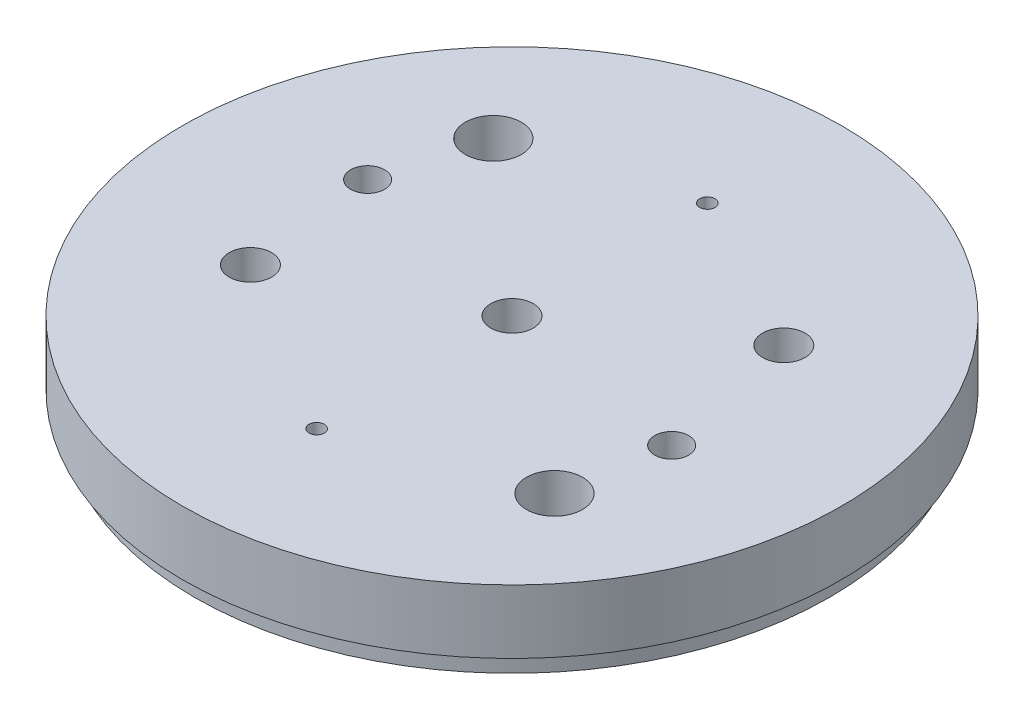
ISO-10303-21;
HEADER;
FILE_DESCRIPTION(('STEP AP214'),'2;1');
FILE_NAME('part.step','',(''),(''),'','','');
FILE_SCHEMA(('AUTOMOTIVE_DESIGN { 1 0 10303 214 1 1 1 1 }'));
ENDSEC;
DATA;
#1=APPLICATION_CONTEXT('core data for automotive mechanical design processes');
#2=APPLICATION_PROTOCOL_DEFINITION('international standard','automotive_design',2000,#1);
#3=PRODUCT_CONTEXT('',#1,'mechanical');
#4=PRODUCT('Part','Part','',(#3));
#5=PRODUCT_RELATED_PRODUCT_CATEGORY('part','',(#4));
#6=PRODUCT_DEFINITION_FORMATION('','',#4);
#7=PRODUCT_DEFINITION_CONTEXT('part definition',#1,'design');
#8=PRODUCT_DEFINITION('design','',#6,#7);
#9=PRODUCT_DEFINITION_SHAPE('','',#8);
#10=(LENGTH_UNIT() NAMED_UNIT(*) SI_UNIT(.MILLI.,.METRE.));
#11=(NAMED_UNIT(*) PLANE_ANGLE_UNIT() SI_UNIT($,.RADIAN.));
#12=(NAMED_UNIT(*) SI_UNIT($,.STERADIAN.) SOLID_ANGLE_UNIT());
#13=UNCERTAINTY_MEASURE_WITH_UNIT(LENGTH_MEASURE(1.E-05),#10,'distance_accuracy_value','');
#14=(GEOMETRIC_REPRESENTATION_CONTEXT(3) GLOBAL_UNCERTAINTY_ASSIGNED_CONTEXT((#13)) GLOBAL_UNIT_ASSIGNED_CONTEXT((#10,
#11,#12)) REPRESENTATION_CONTEXT('',''));
#15=CARTESIAN_POINT('',(0.,0.,0.));
#16=DIRECTION('',(0.,0.,1.));
#17=DIRECTION('',(1.,0.,0.));
#18=AXIS2_PLACEMENT_3D('',#15,#16,#17);
#19=CARTESIAN_POINT('',(0.,-9.525,0.));
#20=DIRECTION('',(0.,1.,0.));
#21=DIRECTION('',(0.,0.,1.));
#22=AXIS2_PLACEMENT_3D('',#19,#20,#21);
#23=CYLINDRICAL_SURFACE('',#22,49.276);
#24=CARTESIAN_POINT('',(0.,-9.525,0.));
#25=DIRECTION('',(0.,1.,0.));
#26=DIRECTION('',(0.,0.,1.));
#27=AXIS2_PLACEMENT_3D('',#24,#25,#26);
#28=CIRCLE('',#27,49.276);
#29=CARTESIAN_POINT('',(0.,-9.525,49.276));
#30=VERTEX_POINT('',#29);
#31=EDGE_CURVE('E39',#30,#30,#28,.T.);
#32=CARTESIAN_POINT('',(0.,0.,0.));
#33=DIRECTION('',(0.,1.,0.));
#34=DIRECTION('',(0.,0.,1.));
#35=AXIS2_PLACEMENT_3D('',#32,#33,#34);
#36=CIRCLE('',#35,49.276);
#37=CARTESIAN_POINT('',(0.,0.,49.276));
#38=VERTEX_POINT('',#37);
#39=EDGE_CURVE('E35',#38,#38,#36,.T.);
#40=CARTESIAN_POINT('',(0.,-9.525,49.276));
#41=CARTESIAN_POINT('',(0.,-9.42578125,49.276));
#42=CARTESIAN_POINT('',(0.,-9.3265625,49.276));
#43=CARTESIAN_POINT('',(0.,-9.128125,49.276));
#44=CARTESIAN_POINT('',(0.,-9.02890625,49.276));
#45=CARTESIAN_POINT('',(0.,-8.83046875,49.276));
#46=CARTESIAN_POINT('',(0.,-8.73125,49.276));
#47=CARTESIAN_POINT('',(0.,-8.5328125,49.276));
#48=CARTESIAN_POINT('',(0.,-8.43359375,49.276));
#49=CARTESIAN_POINT('',(0.,-8.23515625,49.276));
#50=CARTESIAN_POINT('',(0.,-8.1359375,49.276));
#51=CARTESIAN_POINT('',(0.,-7.9375,49.276));
#52=CARTESIAN_POINT('',(0.,-7.83828125,49.276));
#53=CARTESIAN_POINT('',(0.,-7.63984375,49.276));
#54=CARTESIAN_POINT('',(0.,-7.540625,49.276));
#55=CARTESIAN_POINT('',(0.,-7.3421875,49.276));
#56=CARTESIAN_POINT('',(0.,-7.24296875,49.276));
#57=CARTESIAN_POINT('',(0.,-7.04453125,49.276));
#58=CARTESIAN_POINT('',(0.,-6.9453125,49.276));
#59=CARTESIAN_POINT('',(0.,-6.746875,49.276));
#60=CARTESIAN_POINT('',(0.,-6.64765625,49.276));
#61=CARTESIAN_POINT('',(0.,-6.44921875,49.276));
#62=CARTESIAN_POINT('',(0.,-6.35,49.276));
#63=CARTESIAN_POINT('',(0.,-6.1515625,49.276));
#64=CARTESIAN_POINT('',(0.,-6.05234375,49.276));
#65=CARTESIAN_POINT('',(0.,-5.85390625,49.276));
#66=CARTESIAN_POINT('',(0.,-5.7546875,49.276));
#67=CARTESIAN_POINT('',(0.,-5.55625,49.276));
#68=CARTESIAN_POINT('',(0.,-5.45703125,49.276));
#69=CARTESIAN_POINT('',(0.,-5.25859375,49.276));
#70=CARTESIAN_POINT('',(0.,-5.159375,49.276));
#71=CARTESIAN_POINT('',(0.,-4.9609375,49.276));
#72=CARTESIAN_POINT('',(0.,-4.86171875,49.276));
#73=CARTESIAN_POINT('',(0.,-4.66328125,49.276));
#74=CARTESIAN_POINT('',(0.,-4.5640625,49.276));
#75=CARTESIAN_POINT('',(0.,-4.365625,49.276));
#76=CARTESIAN_POINT('',(0.,-4.26640625,49.276));
#77=CARTESIAN_POINT('',(0.,-4.06796875,49.276));
#78=CARTESIAN_POINT('',(0.,-3.96875,49.276));
#79=CARTESIAN_POINT('',(0.,-3.7703125,49.276));
#80=CARTESIAN_POINT('',(0.,-3.67109375,49.276));
#81=CARTESIAN_POINT('',(0.,-3.47265625,49.276));
#82=CARTESIAN_POINT('',(0.,-3.3734375,49.276));
#83=CARTESIAN_POINT('',(0.,-3.175,49.276));
#84=CARTESIAN_POINT('',(0.,-3.07578125,49.276));
#85=CARTESIAN_POINT('',(0.,-2.87734375,49.276));
#86=CARTESIAN_POINT('',(0.,-2.778125,49.276));
#87=CARTESIAN_POINT('',(0.,-2.5796875,49.276));
#88=CARTESIAN_POINT('',(0.,-2.48046875,49.276));
#89=CARTESIAN_POINT('',(0.,-2.28203125,49.276));
#90=CARTESIAN_POINT('',(0.,-2.1828125,49.276));
#91=CARTESIAN_POINT('',(0.,-1.984375,49.276));
#92=CARTESIAN_POINT('',(0.,-1.88515625,49.276));
#93=CARTESIAN_POINT('',(0.,-1.68671875,49.276));
#94=CARTESIAN_POINT('',(0.,-1.5875,49.276));
#95=CARTESIAN_POINT('',(0.,-1.3890625,49.276));
#96=CARTESIAN_POINT('',(0.,-1.28984375,49.276));
#97=CARTESIAN_POINT('',(0.,-1.09140625,49.276));
#98=CARTESIAN_POINT('',(0.,-0.992187500000001,49.276));
#99=CARTESIAN_POINT('',(0.,-0.793750000000001,49.276));
#100=CARTESIAN_POINT('',(0.,-0.69453125,49.276));
#101=CARTESIAN_POINT('',(0.,-0.49609375,49.276));
#102=CARTESIAN_POINT('',(0.,-0.396875,49.276));
#103=CARTESIAN_POINT('',(0.,-0.1984375,49.276));
#104=CARTESIAN_POINT('',(0.,-0.0992187500000001,49.276));
#105=CARTESIAN_POINT('',(0.,0.,49.276));
#106=B_SPLINE_CURVE_WITH_KNOTS('',3,(#40,#41,#42,#43,#44,#45,#46,#47,#48,#49,#50,#51,#52,#53,
#54,#55,#56,#57,#58,#59,#60,#61,#62,#63,#64,#65,#66,#67,#68,#69,#70,#71,#72,#73,#74,#75,#76,#77,
#78,#79,#80,#81,#82,#83,#84,#85,#86,#87,#88,#89,#90,#91,#92,#93,#94,#95,#96,#97,#98,#99,#100,
#101,#102,#103,#104,#105),.UNSPECIFIED.,.F.,.F.,(4,2,2,2,2,2,2,2,2,2,2,2,2,2,2,2,2,2,2,2,2,2,2,
2,2,2,2,2,2,2,2,2,4),(0.,0.29765625,0.5953125,0.892968750000001,1.190625,1.48828125,1.7859375,
2.08359375,2.38125,2.67890625,2.9765625,3.27421875,3.571875,3.86953125,4.1671875,4.46484375,
4.7625,5.06015625,5.3578125,5.65546875,5.953125,6.25078125,6.5484375,6.84609375,7.14375,
7.44140625,7.7390625,8.03671875,8.334375,8.63203125,8.9296875,9.22734375,9.525),.UNSPECIFIED.);
#107=EDGE_CURVE('BSEAM32',#30,#38,#106,.T.);
#108=ORIENTED_EDGE('',*,*,#31,.T.);
#109=ORIENTED_EDGE('',*,*,#39,.F.);
#110=ORIENTED_EDGE('',*,*,#107,.T.);
#111=ORIENTED_EDGE('',*,*,#107,.F.);
#112=EDGE_LOOP('',(#108,#110,#109,#111));
#113=FACE_BOUND('',#112,.T.);
#114=ADVANCED_FACE('F32',(#113),#23,.T.);
#115=CARTESIAN_POINT('',(0.,-9.525,0.));
#116=DIRECTION('',(0.,1.,0.));
#117=DIRECTION('',(0.,0.,1.));
#118=AXIS2_PLACEMENT_3D('',#115,#116,#117);
#119=PLANE('',#118);
#120=CARTESIAN_POINT('',(0.,-9.525,0.));
#121=DIRECTION('',(0.,-1.,0.));
#122=DIRECTION('',(0.,0.,-1.));
#123=AXIS2_PLACEMENT_3D('',#120,#121,#122);
#124=CIRCLE('',#123,47.498);
#125=CARTESIAN_POINT('',(0.,-9.525,-47.498));
#126=VERTEX_POINT('',#125);
#127=EDGE_CURVE('E10',#126,#126,#124,.T.);
#128=ORIENTED_EDGE('',*,*,#127,.F.);
#129=EDGE_LOOP('',(#128));
#130=FACE_BOUND('',#129,.T.);
#131=ORIENTED_EDGE('',*,*,#31,.F.);
#132=EDGE_LOOP('',(#131));
#133=FACE_BOUND('',#132,.T.);
#134=ADVANCED_FACE('F118',(#130,#133),#119,.F.);
#135=CARTESIAN_POINT('',(0.,0.,0.));
#136=DIRECTION('',(0.,1.,0.));
#137=DIRECTION('',(0.,0.,1.));
#138=AXIS2_PLACEMENT_3D('',#135,#136,#137);
#139=PLANE('',#138);
#140=CARTESIAN_POINT('',(0.,0.,-29.21));
#141=DIRECTION('',(0.,1.,0.));
#142=DIRECTION('',(0.,0.,1.));
#143=AXIS2_PLACEMENT_3D('',#140,#141,#142);
#144=CIRCLE('',#143,1.143);
#145=CARTESIAN_POINT('',(0.,0.,-28.067));
#146=VERTEX_POINT('',#145);
#147=EDGE_CURVE('E74',#146,#146,#144,.T.);
#148=ORIENTED_EDGE('',*,*,#147,.F.);
#149=EDGE_LOOP('',(#148));
#150=FACE_BOUND('',#149,.T.);
#151=CARTESIAN_POINT('',(0.,0.,29.21));
#152=DIRECTION('',(0.,1.,0.));
#153=DIRECTION('',(0.,0.,1.));
#154=AXIS2_PLACEMENT_3D('',#151,#152,#153);
#155=CIRCLE('',#154,1.143);
#156=CARTESIAN_POINT('',(0.,0.,30.353));
#157=VERTEX_POINT('',#156);
#158=EDGE_CURVE('E68',#157,#157,#155,.T.);
#159=ORIENTED_EDGE('',*,*,#158,.F.);
#160=EDGE_LOOP('',(#159));
#161=FACE_BOUND('',#160,.T.);
#162=CARTESIAN_POINT('',(-24.384,0.,-21.59));
#163=DIRECTION('',(0.,1.,0.));
#164=DIRECTION('',(0.,0.,1.));
#165=AXIS2_PLACEMENT_3D('',#162,#163,#164);
#166=CIRCLE('',#165,4.191);
#167=CARTESIAN_POINT('',(-24.384,0.,-17.399));
#168=VERTEX_POINT('',#167);
#169=EDGE_CURVE('E62',#168,#168,#166,.T.);
#170=ORIENTED_EDGE('',*,*,#169,.F.);
#171=EDGE_LOOP('',(#170));
#172=FACE_BOUND('',#171,.T.);
#173=CARTESIAN_POINT('',(-28.448,0.,-6.858));
#174=DIRECTION('',(0.,1.,0.));
#175=DIRECTION('',(0.,0.,1.));
#176=AXIS2_PLACEMENT_3D('',#173,#174,#175);
#177=CIRCLE('',#176,2.54);
#178=CARTESIAN_POINT('',(-28.448,0.,-4.318));
#179=VERTEX_POINT('',#178);
#180=EDGE_CURVE('E55',#179,#179,#177,.T.);
#181=ORIENTED_EDGE('',*,*,#180,.F.);
#182=EDGE_LOOP('',(#181));
#183=FACE_BOUND('',#182,.T.);
#184=CARTESIAN_POINT('',(-26.162,0.,12.954));
#185=DIRECTION('',(0.,1.,0.));
#186=DIRECTION('',(0.,0.,1.));
#187=AXIS2_PLACEMENT_3D('',#184,#185,#186);
#188=CIRCLE('',#187,3.175);
#189=CARTESIAN_POINT('',(-26.162,0.,16.129));
#190=VERTEX_POINT('',#189);
#191=EDGE_CURVE('E97',#190,#190,#188,.T.);
#192=ORIENTED_EDGE('',*,*,#191,.F.);
#193=EDGE_LOOP('',(#192));
#194=FACE_BOUND('',#193,.T.);
#195=CARTESIAN_POINT('',(26.162,0.,19.812));
#196=DIRECTION('',(0.,1.,0.));
#197=DIRECTION('',(0.,0.,1.));
#198=AXIS2_PLACEMENT_3D('',#195,#196,#197);
#199=CIRCLE('',#198,4.191);
#200=CARTESIAN_POINT('',(26.162,0.,24.003));
#201=VERTEX_POINT('',#200);
#202=EDGE_CURVE('E91',#201,#201,#199,.T.);
#203=ORIENTED_EDGE('',*,*,#202,.F.);
#204=EDGE_LOOP('',(#203));
#205=FACE_BOUND('',#204,.T.);
#206=CARTESIAN_POINT('',(28.702,0.,4.826));
#207=DIRECTION('',(0.,1.,0.));
#208=DIRECTION('',(0.,0.,1.));
#209=AXIS2_PLACEMENT_3D('',#206,#207,#208);
#210=CIRCLE('',#209,2.54);
#211=CARTESIAN_POINT('',(28.702,0.,7.366));
#212=VERTEX_POINT('',#211);
#213=EDGE_CURVE('E85',#212,#212,#210,.T.);
#214=ORIENTED_EDGE('',*,*,#213,.F.);
#215=EDGE_LOOP('',(#214));
#216=FACE_BOUND('',#215,.T.);
#217=CARTESIAN_POINT('',(24.13,0.,-16.51));
#218=DIRECTION('',(0.,1.,0.));
#219=DIRECTION('',(0.,0.,1.));
#220=AXIS2_PLACEMENT_3D('',#217,#218,#219);
#221=CIRCLE('',#220,3.175);
#222=CARTESIAN_POINT('',(24.13,0.,-13.335));
#223=VERTEX_POINT('',#222);
#224=EDGE_CURVE('E79',#223,#223,#221,.T.);
#225=ORIENTED_EDGE('',*,*,#224,.F.);
#226=EDGE_LOOP('',(#225));
#227=FACE_BOUND('',#226,.T.);
#228=CARTESIAN_POINT('',(0.,0.,0.));
#229=DIRECTION('',(0.,1.,0.));
#230=DIRECTION('',(0.,0.,1.));
#231=AXIS2_PLACEMENT_3D('',#228,#229,#230);
#232=CIRCLE('',#231,3.175);
#233=CARTESIAN_POINT('',(0.,0.,3.175));
#234=VERTEX_POINT('',#233);
#235=EDGE_CURVE('E49',#234,#234,#232,.T.);
#236=ORIENTED_EDGE('',*,*,#235,.F.);
#237=EDGE_LOOP('',(#236));
#238=FACE_BOUND('',#237,.T.);
#239=ORIENTED_EDGE('',*,*,#39,.T.);
#240=EDGE_LOOP('',(#239));
#241=FACE_BOUND('',#240,.T.);
#242=ADVANCED_FACE('F114',(#150,#161,#172,#183,#194,#205,#216,#227,#238,#241),#139,.T.);
#243=CARTESIAN_POINT('',(0.,-12.7,0.));
#244=DIRECTION('',(0.,1.,0.));
#245=DIRECTION('',(0.,0.,1.));
#246=AXIS2_PLACEMENT_3D('',#243,#244,#245);
#247=CYLINDRICAL_SURFACE('',#246,47.498);
#248=CARTESIAN_POINT('',(0.,-12.7,0.));
#249=DIRECTION('',(0.,-1.,0.));
#250=DIRECTION('',(0.,0.,-1.));
#251=AXIS2_PLACEMENT_3D('',#248,#249,#250);
#252=CIRCLE('',#251,47.498);
#253=CARTESIAN_POINT('',(0.,-12.7,-47.498));
#254=VERTEX_POINT('',#253);
#255=EDGE_CURVE('E45',#254,#254,#252,.T.);
#256=ORIENTED_EDGE('',*,*,#255,.F.);
#257=EDGE_LOOP('',(#256));
#258=FACE_BOUND('',#257,.T.);
#259=ORIENTED_EDGE('',*,*,#127,.T.);
#260=EDGE_LOOP('',(#259));
#261=FACE_BOUND('',#260,.T.);
#262=ADVANCED_FACE('F117',(#258,#261),#247,.T.);
#263=CARTESIAN_POINT('',(0.,-12.7,0.));
#264=DIRECTION('',(0.,-1.,0.));
#265=DIRECTION('',(0.,0.,-1.));
#266=AXIS2_PLACEMENT_3D('',#263,#264,#265);
#267=PLANE('',#266);
#268=CARTESIAN_POINT('',(0.,-12.7,-29.21));
#269=DIRECTION('',(0.,1.,0.));
#270=DIRECTION('',(0.,0.,1.));
#271=AXIS2_PLACEMENT_3D('',#268,#269,#270);
#272=CIRCLE('',#271,1.143);
#273=CARTESIAN_POINT('',(0.,-12.7,-28.067));
#274=VERTEX_POINT('',#273);
#275=EDGE_CURVE('E52',#274,#274,#272,.T.);
#276=ORIENTED_EDGE('',*,*,#275,.T.);
#277=EDGE_LOOP('',(#276));
#278=FACE_BOUND('',#277,.T.);
#279=CARTESIAN_POINT('',(0.,-12.7,29.21));
#280=DIRECTION('',(0.,1.,0.));
#281=DIRECTION('',(0.,0.,1.));
#282=AXIS2_PLACEMENT_3D('',#279,#280,#281);
#283=CIRCLE('',#282,1.143);
#284=CARTESIAN_POINT('',(0.,-12.7,30.353));
#285=VERTEX_POINT('',#284);
#286=EDGE_CURVE('E71',#285,#285,#283,.T.);
#287=ORIENTED_EDGE('',*,*,#286,.T.);
#288=EDGE_LOOP('',(#287));
#289=FACE_BOUND('',#288,.T.);
#290=CARTESIAN_POINT('',(-24.384,-12.7,-21.59));
#291=DIRECTION('',(0.,1.,0.));
#292=DIRECTION('',(0.,0.,1.));
#293=AXIS2_PLACEMENT_3D('',#290,#291,#292);
#294=CIRCLE('',#293,4.191);
#295=CARTESIAN_POINT('',(-24.384,-12.7,-17.399));
#296=VERTEX_POINT('',#295);
#297=EDGE_CURVE('E65',#296,#296,#294,.T.);
#298=ORIENTED_EDGE('',*,*,#297,.T.);
#299=EDGE_LOOP('',(#298));
#300=FACE_BOUND('',#299,.T.);
#301=CARTESIAN_POINT('',(-28.448,-12.7,-6.858));
#302=DIRECTION('',(0.,1.,0.));
#303=DIRECTION('',(0.,0.,1.));
#304=AXIS2_PLACEMENT_3D('',#301,#302,#303);
#305=CIRCLE('',#304,2.54);
#306=CARTESIAN_POINT('',(-28.448,-12.7,-4.318));
#307=VERTEX_POINT('',#306);
#308=EDGE_CURVE('E58',#307,#307,#305,.T.);
#309=ORIENTED_EDGE('',*,*,#308,.T.);
#310=EDGE_LOOP('',(#309));
#311=FACE_BOUND('',#310,.T.);
#312=CARTESIAN_POINT('',(-26.162,-12.7,12.954));
#313=DIRECTION('',(0.,1.,0.));
#314=DIRECTION('',(0.,0.,1.));
#315=AXIS2_PLACEMENT_3D('',#312,#313,#314);
#316=CIRCLE('',#315,3.175);
#317=CARTESIAN_POINT('',(-26.162,-12.7,16.129));
#318=VERTEX_POINT('',#317);
#319=EDGE_CURVE('E59',#318,#318,#316,.T.);
#320=ORIENTED_EDGE('',*,*,#319,.T.);
#321=EDGE_LOOP('',(#320));
#322=FACE_BOUND('',#321,.T.);
#323=CARTESIAN_POINT('',(26.162,-12.7,19.812));
#324=DIRECTION('',(0.,1.,0.));
#325=DIRECTION('',(0.,0.,1.));
#326=AXIS2_PLACEMENT_3D('',#323,#324,#325);
#327=CIRCLE('',#326,4.191);
#328=CARTESIAN_POINT('',(26.162,-12.7,24.003));
#329=VERTEX_POINT('',#328);
#330=EDGE_CURVE('E94',#329,#329,#327,.T.);
#331=ORIENTED_EDGE('',*,*,#330,.T.);
#332=EDGE_LOOP('',(#331));
#333=FACE_BOUND('',#332,.T.);
#334=CARTESIAN_POINT('',(28.702,-12.7,4.826));
#335=DIRECTION('',(0.,1.,0.));
#336=DIRECTION('',(0.,0.,1.));
#337=AXIS2_PLACEMENT_3D('',#334,#335,#336);
#338=CIRCLE('',#337,2.54);
#339=CARTESIAN_POINT('',(28.702,-12.7,7.366));
#340=VERTEX_POINT('',#339);
#341=EDGE_CURVE('E88',#340,#340,#338,.T.);
#342=ORIENTED_EDGE('',*,*,#341,.T.);
#343=EDGE_LOOP('',(#342));
#344=FACE_BOUND('',#343,.T.);
#345=CARTESIAN_POINT('',(24.13,-12.7,-16.51));
#346=DIRECTION('',(0.,1.,0.));
#347=DIRECTION('',(0.,0.,1.));
#348=AXIS2_PLACEMENT_3D('',#345,#346,#347);
#349=CIRCLE('',#348,3.175);
#350=CARTESIAN_POINT('',(24.13,-12.7,-13.335));
#351=VERTEX_POINT('',#350);
#352=EDGE_CURVE('E82',#351,#351,#349,.T.);
#353=ORIENTED_EDGE('',*,*,#352,.T.);
#354=EDGE_LOOP('',(#353));
#355=FACE_BOUND('',#354,.T.);
#356=CARTESIAN_POINT('',(0.,-12.7,0.));
#357=DIRECTION('',(0.,1.,0.));
#358=DIRECTION('',(0.,0.,1.));
#359=AXIS2_PLACEMENT_3D('',#356,#357,#358);
#360=CIRCLE('',#359,3.175);
#361=CARTESIAN_POINT('',(0.,-12.7,3.175));
#362=VERTEX_POINT('',#361);
#363=EDGE_CURVE('E48',#362,#362,#360,.T.);
#364=ORIENTED_EDGE('',*,*,#363,.T.);
#365=EDGE_LOOP('',(#364));
#366=FACE_BOUND('',#365,.T.);
#367=ORIENTED_EDGE('',*,*,#255,.T.);
#368=EDGE_LOOP('',(#367));
#369=FACE_BOUND('',#368,.T.);
#370=ADVANCED_FACE('F103',(#278,#289,#300,#311,#322,#333,#344,#355,#366,#369),#267,.T.);
#371=CARTESIAN_POINT('',(0.,-12.7,0.));
#372=DIRECTION('',(0.,1.,0.));
#373=DIRECTION('',(0.,0.,1.));
#374=AXIS2_PLACEMENT_3D('',#371,#372,#373);
#375=CYLINDRICAL_SURFACE('',#374,3.175);
#376=ORIENTED_EDGE('',*,*,#363,.F.);
#377=EDGE_LOOP('',(#376));
#378=FACE_BOUND('',#377,.T.);
#379=ORIENTED_EDGE('',*,*,#235,.T.);
#380=EDGE_LOOP('',(#379));
#381=FACE_BOUND('',#380,.T.);
#382=ADVANCED_FACE('F148',(#378,#381),#375,.F.);
#383=CARTESIAN_POINT('',(24.13,-12.7,-16.51));
#384=DIRECTION('',(0.,1.,0.));
#385=DIRECTION('',(0.,0.,1.));
#386=AXIS2_PLACEMENT_3D('',#383,#384,#385);
#387=CYLINDRICAL_SURFACE('',#386,3.175);
#388=ORIENTED_EDGE('',*,*,#352,.F.);
#389=EDGE_LOOP('',(#388));
#390=FACE_BOUND('',#389,.T.);
#391=ORIENTED_EDGE('',*,*,#224,.T.);
#392=EDGE_LOOP('',(#391));
#393=FACE_BOUND('',#392,.T.);
#394=ADVANCED_FACE('F152',(#390,#393),#387,.F.);
#395=CARTESIAN_POINT('',(28.702,-12.7,4.826));
#396=DIRECTION('',(0.,1.,0.));
#397=DIRECTION('',(0.,0.,1.));
#398=AXIS2_PLACEMENT_3D('',#395,#396,#397);
#399=CYLINDRICAL_SURFACE('',#398,2.54);
#400=ORIENTED_EDGE('',*,*,#341,.F.);
#401=EDGE_LOOP('',(#400));
#402=FACE_BOUND('',#401,.T.);
#403=ORIENTED_EDGE('',*,*,#213,.T.);
#404=EDGE_LOOP('',(#403));
#405=FACE_BOUND('',#404,.T.);
#406=ADVANCED_FACE('F171',(#402,#405),#399,.F.);
#407=CARTESIAN_POINT('',(26.162,-12.7,19.812));
#408=DIRECTION('',(0.,1.,0.));
#409=DIRECTION('',(0.,0.,1.));
#410=AXIS2_PLACEMENT_3D('',#407,#408,#409);
#411=CYLINDRICAL_SURFACE('',#410,4.191);
#412=ORIENTED_EDGE('',*,*,#330,.F.);
#413=EDGE_LOOP('',(#412));
#414=FACE_BOUND('',#413,.T.);
#415=ORIENTED_EDGE('',*,*,#202,.T.);
#416=EDGE_LOOP('',(#415));
#417=FACE_BOUND('',#416,.T.);
#418=ADVANCED_FACE('F110',(#414,#417),#411,.F.);
#419=CARTESIAN_POINT('',(-26.162,-12.7,12.954));
#420=DIRECTION('',(0.,1.,0.));
#421=DIRECTION('',(0.,0.,1.));
#422=AXIS2_PLACEMENT_3D('',#419,#420,#421);
#423=CYLINDRICAL_SURFACE('',#422,3.175);
#424=ORIENTED_EDGE('',*,*,#319,.F.);
#425=EDGE_LOOP('',(#424));
#426=FACE_BOUND('',#425,.T.);
#427=ORIENTED_EDGE('',*,*,#191,.T.);
#428=EDGE_LOOP('',(#427));
#429=FACE_BOUND('',#428,.T.);
#430=ADVANCED_FACE('F106',(#426,#429),#423,.F.);
#431=CARTESIAN_POINT('',(-28.448,-12.7,-6.858));
#432=DIRECTION('',(0.,1.,0.));
#433=DIRECTION('',(0.,0.,1.));
#434=AXIS2_PLACEMENT_3D('',#431,#432,#433);
#435=CYLINDRICAL_SURFACE('',#434,2.54);
#436=ORIENTED_EDGE('',*,*,#308,.F.);
#437=EDGE_LOOP('',(#436));
#438=FACE_BOUND('',#437,.T.);
#439=ORIENTED_EDGE('',*,*,#180,.T.);
#440=EDGE_LOOP('',(#439));
#441=FACE_BOUND('',#440,.T.);
#442=ADVANCED_FACE('F109',(#438,#441),#435,.F.);
#443=CARTESIAN_POINT('',(-24.384,-12.7,-21.59));
#444=DIRECTION('',(0.,1.,0.));
#445=DIRECTION('',(0.,0.,1.));
#446=AXIS2_PLACEMENT_3D('',#443,#444,#445);
#447=CYLINDRICAL_SURFACE('',#446,4.191);
#448=ORIENTED_EDGE('',*,*,#297,.F.);
#449=EDGE_LOOP('',(#448));
#450=FACE_BOUND('',#449,.T.);
#451=ORIENTED_EDGE('',*,*,#169,.T.);
#452=EDGE_LOOP('',(#451));
#453=FACE_BOUND('',#452,.T.);
#454=ADVANCED_FACE('F156',(#450,#453),#447,.F.);
#455=CARTESIAN_POINT('',(0.,-12.7,29.21));
#456=DIRECTION('',(0.,1.,0.));
#457=DIRECTION('',(0.,0.,1.));
#458=AXIS2_PLACEMENT_3D('',#455,#456,#457);
#459=CYLINDRICAL_SURFACE('',#458,1.143);
#460=ORIENTED_EDGE('',*,*,#286,.F.);
#461=EDGE_LOOP('',(#460));
#462=FACE_BOUND('',#461,.T.);
#463=ORIENTED_EDGE('',*,*,#158,.T.);
#464=EDGE_LOOP('',(#463));
#465=FACE_BOUND('',#464,.T.);
#466=ADVANCED_FACE('F160',(#462,#465),#459,.F.);
#467=CARTESIAN_POINT('',(0.,-12.7,-29.21));
#468=DIRECTION('',(0.,1.,0.));
#469=DIRECTION('',(0.,0.,1.));
#470=AXIS2_PLACEMENT_3D('',#467,#468,#469);
#471=CYLINDRICAL_SURFACE('',#470,1.143);
#472=ORIENTED_EDGE('',*,*,#275,.F.);
#473=EDGE_LOOP('',(#472));
#474=FACE_BOUND('',#473,.T.);
#475=ORIENTED_EDGE('',*,*,#147,.T.);
#476=EDGE_LOOP('',(#475));
#477=FACE_BOUND('',#476,.T.);
#478=ADVANCED_FACE('F164',(#474,#477),#471,.F.);
#479=CLOSED_SHELL('',(#114,#134,#242,#262,#370,#382,#394,#406,#418,#430,#442,#454,#466,#478));
#480=MANIFOLD_SOLID_BREP('B2',#479);
#481=ADVANCED_BREP_SHAPE_REPRESENTATION('',(#18,#480),#14);
#482=SHAPE_DEFINITION_REPRESENTATION(#9,#481);
ENDSEC;
END-ISO-10303-21;
